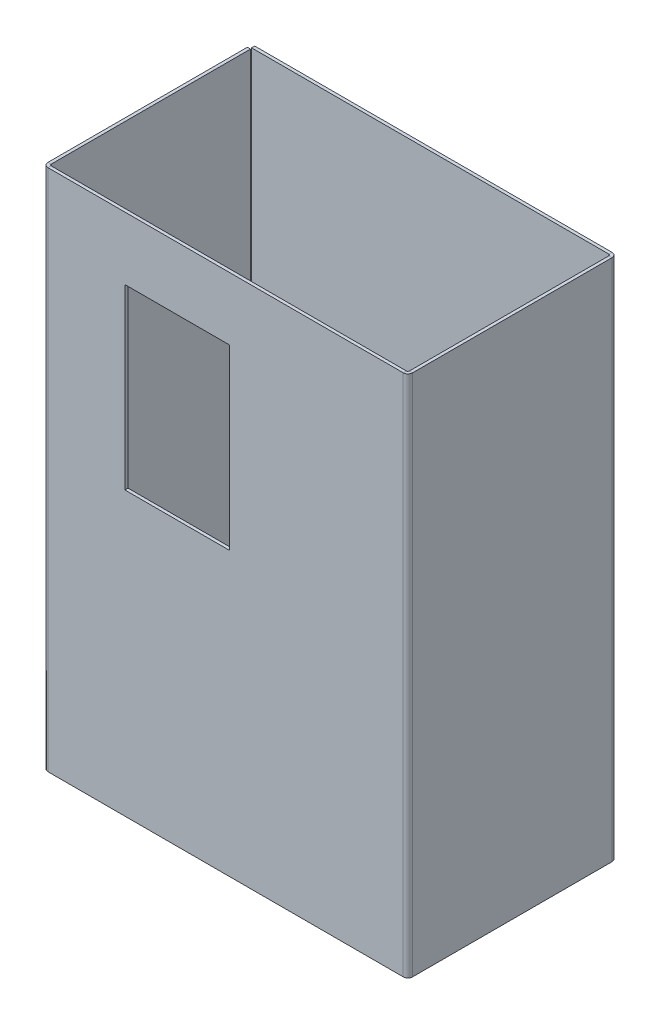
ISO-10303-21;
HEADER;
FILE_DESCRIPTION(('STEP AP214'),'2;1');
FILE_NAME('part.step','',(''),(''),'','','');
FILE_SCHEMA(('AUTOMOTIVE_DESIGN { 1 0 10303 214 1 1 1 1 }'));
ENDSEC;
DATA;
#1=APPLICATION_CONTEXT('core data for automotive mechanical design processes');
#2=APPLICATION_PROTOCOL_DEFINITION('international standard','automotive_design',2000,#1);
#3=PRODUCT_CONTEXT('',#1,'mechanical');
#4=PRODUCT('Part','Part','',(#3));
#5=PRODUCT_RELATED_PRODUCT_CATEGORY('part','',(#4));
#6=PRODUCT_DEFINITION_FORMATION('','',#4);
#7=PRODUCT_DEFINITION_CONTEXT('part definition',#1,'design');
#8=PRODUCT_DEFINITION('design','',#6,#7);
#9=PRODUCT_DEFINITION_SHAPE('','',#8);
#10=(LENGTH_UNIT() NAMED_UNIT(*) SI_UNIT(.MILLI.,.METRE.));
#11=(NAMED_UNIT(*) PLANE_ANGLE_UNIT() SI_UNIT($,.RADIAN.));
#12=(NAMED_UNIT(*) SI_UNIT($,.STERADIAN.) SOLID_ANGLE_UNIT());
#13=UNCERTAINTY_MEASURE_WITH_UNIT(LENGTH_MEASURE(1.E-05),#10,'distance_accuracy_value','');
#14=(GEOMETRIC_REPRESENTATION_CONTEXT(3) GLOBAL_UNCERTAINTY_ASSIGNED_CONTEXT((#13)) GLOBAL_UNIT_ASSIGNED_CONTEXT((#10,
#11,#12)) REPRESENTATION_CONTEXT('',''));
#15=CARTESIAN_POINT('',(0.,0.,0.));
#16=DIRECTION('',(0.,0.,1.));
#17=DIRECTION('',(1.,0.,0.));
#18=AXIS2_PLACEMENT_3D('',#15,#16,#17);
#19=CARTESIAN_POINT('',(199.282314285715,-112.5,267.428545819413));
#20=DIRECTION('',(0.,-1.,0.));
#21=DIRECTION('',(-1.,0.,0.));
#22=AXIS2_PLACEMENT_3D('',#19,#20,#21);
#23=PLANE('',#22);
#24=DIRECTION('',(0.,0.,-1.));
#25=VECTOR('',#24,1.);
#26=CARTESIAN_POINT('',(199.282314285715,-112.5,267.428545819413));
#27=LINE('',#26,#25);
#28=CARTESIAN_POINT('',(199.282314285714,-112.5,-2.2366));
#29=VERTEX_POINT('',#28);
#30=CARTESIAN_POINT('',(199.282314285714,-112.5,-97.4965999999999));
#31=VERTEX_POINT('',#30);
#32=EDGE_CURVE('E296',#29,#31,#27,.T.);
#33=ORIENTED_EDGE('',*,*,#32,.T.);
#34=DIRECTION('',(1.,0.,0.));
#35=VECTOR('',#34,1.);
#36=CARTESIAN_POINT('',(199.282314285714,-112.5,-97.4966));
#37=LINE('',#36,#35);
#38=CARTESIAN_POINT('',(200.782314285714,-112.5,-97.4965999999999));
#39=VERTEX_POINT('',#38);
#40=EDGE_CURVE('E12',#31,#39,#37,.T.);
#41=ORIENTED_EDGE('',*,*,#40,.T.);
#42=DIRECTION('',(0.,0.,-1.));
#43=VECTOR('',#42,1.);
#44=CARTESIAN_POINT('',(200.782314285715,-112.5,267.428545819413));
#45=LINE('',#44,#43);
#46=CARTESIAN_POINT('',(200.782314285714,-112.5,-2.23660000000001));
#47=VERTEX_POINT('',#46);
#48=EDGE_CURVE('E273',#47,#39,#45,.T.);
#49=ORIENTED_EDGE('',*,*,#48,.F.);
#50=DIRECTION('',(1.,0.,0.));
#51=VECTOR('',#50,1.);
#52=CARTESIAN_POINT('',(199.282314285714,-112.5,-2.23660000000012));
#53=LINE('',#52,#51);
#54=EDGE_CURVE('E278',#29,#47,#53,.T.);
#55=ORIENTED_EDGE('',*,*,#54,.F.);
#56=EDGE_LOOP('',(#33,#41,#49,#55));
#57=FACE_BOUND('',#56,.T.);
#58=ADVANCED_FACE('F51',(#57),#23,.T.);
#59=CARTESIAN_POINT('',(199.282314285715,137.5,267.428545819413));
#60=DIRECTION('',(0.,1.,0.));
#61=DIRECTION('',(1.,0.,0.));
#62=AXIS2_PLACEMENT_3D('',#59,#60,#61);
#63=PLANE('',#62);
#64=DIRECTION('',(0.,0.,1.));
#65=VECTOR('',#64,1.);
#66=CARTESIAN_POINT('',(200.782314285715,137.5,267.428545819413));
#67=LINE('',#66,#65);
#68=CARTESIAN_POINT('',(200.782314285714,137.5,-97.4965999999998));
#69=VERTEX_POINT('',#68);
#70=CARTESIAN_POINT('',(200.782314285714,137.5,-2.23660000000001));
#71=VERTEX_POINT('',#70);
#72=EDGE_CURVE('E274',#69,#71,#67,.T.);
#73=ORIENTED_EDGE('',*,*,#72,.F.);
#74=DIRECTION('',(-1.,0.,0.));
#75=VECTOR('',#74,1.);
#76=CARTESIAN_POINT('',(199.282314285714,137.5,-97.4966));
#77=LINE('',#76,#75);
#78=CARTESIAN_POINT('',(199.282314285714,137.5,-97.4965999999999));
#79=VERTEX_POINT('',#78);
#80=EDGE_CURVE('E375',#69,#79,#77,.T.);
#81=ORIENTED_EDGE('',*,*,#80,.T.);
#82=DIRECTION('',(0.,0.,1.));
#83=VECTOR('',#82,1.);
#84=CARTESIAN_POINT('',(199.282314285715,137.5,267.428545819413));
#85=LINE('',#84,#83);
#86=CARTESIAN_POINT('',(199.282314285714,137.5,-2.23660000000001));
#87=VERTEX_POINT('',#86);
#88=EDGE_CURVE('E54',#79,#87,#85,.T.);
#89=ORIENTED_EDGE('',*,*,#88,.T.);
#90=DIRECTION('',(-1.,0.,0.));
#91=VECTOR('',#90,1.);
#92=CARTESIAN_POINT('',(199.282314285714,137.5,-2.23660000000012));
#93=LINE('',#92,#91);
#94=EDGE_CURVE('E275',#71,#87,#93,.T.);
#95=ORIENTED_EDGE('',*,*,#94,.F.);
#96=EDGE_LOOP('',(#73,#81,#89,#95));
#97=FACE_BOUND('',#96,.T.);
#98=ADVANCED_FACE('F389',(#97),#63,.T.);
#99=CARTESIAN_POINT('',(199.282314285715,0.,198.644260105127));
#100=DIRECTION('',(-1.,0.,0.));
#101=DIRECTION('',(0.,0.,1.));
#102=AXIS2_PLACEMENT_3D('',#99,#100,#101);
#103=PLANE('',#102);
#104=ORIENTED_EDGE('',*,*,#88,.F.);
#105=DIRECTION('',(0.,-1.,0.));
#106=VECTOR('',#105,1.);
#107=CARTESIAN_POINT('',(199.282314285714,0.,-97.4966));
#108=LINE('',#107,#106);
#109=EDGE_CURVE('E366',#79,#31,#108,.T.);
#110=ORIENTED_EDGE('',*,*,#109,.T.);
#111=ORIENTED_EDGE('',*,*,#32,.F.);
#112=DIRECTION('',(0.,-1.,0.));
#113=VECTOR('',#112,1.);
#114=CARTESIAN_POINT('',(199.282314285714,0.,-2.23660000000012));
#115=LINE('',#114,#113);
#116=EDGE_CURVE('E265',#87,#29,#115,.T.);
#117=ORIENTED_EDGE('',*,*,#116,.F.);
#118=EDGE_LOOP('',(#104,#110,#111,#117));
#119=FACE_BOUND('',#118,.T.);
#120=ADVANCED_FACE('F393',(#119),#103,.T.);
#121=CARTESIAN_POINT('',(-68.7842857142857,-112.5,-1.5));
#122=DIRECTION('',(0.,-1.,0.));
#123=DIRECTION('',(0.,0.,-1.));
#124=AXIS2_PLACEMENT_3D('',#121,#122,#123);
#125=PLANE('',#124);
#126=DIRECTION('',(1.,0.,0.));
#127=VECTOR('',#126,1.);
#128=CARTESIAN_POINT('',(-68.7842857142857,-112.5,-1.5));
#129=LINE('',#128,#127);
#130=CARTESIAN_POINT('',(28.8157142857143,-112.5,-1.5));
#131=VERTEX_POINT('',#130);
#132=CARTESIAN_POINT('',(198.545714285714,-112.5,-1.5));
#133=VERTEX_POINT('',#132);
#134=EDGE_CURVE('E331',#131,#133,#129,.T.);
#135=ORIENTED_EDGE('',*,*,#134,.T.);
#136=DIRECTION('',(0.,0.,1.));
#137=VECTOR('',#136,1.);
#138=CARTESIAN_POINT('',(198.545714285714,-112.5,-1.5));
#139=LINE('',#138,#137);
#140=CARTESIAN_POINT('',(198.545714285714,-112.5,0.));
#141=VERTEX_POINT('',#140);
#142=EDGE_CURVE('E363',#133,#141,#139,.T.);
#143=ORIENTED_EDGE('',*,*,#142,.T.);
#144=DIRECTION('',(1.,0.,0.));
#145=VECTOR('',#144,1.);
#146=CARTESIAN_POINT('',(-68.7842857142857,-112.5,0.));
#147=LINE('',#146,#145);
#148=CARTESIAN_POINT('',(28.8157142857143,-112.5,0.));
#149=VERTEX_POINT('',#148);
#150=EDGE_CURVE('E311',#149,#141,#147,.T.);
#151=ORIENTED_EDGE('',*,*,#150,.F.);
#152=DIRECTION('',(0.,0.,1.));
#153=VECTOR('',#152,1.);
#154=CARTESIAN_POINT('',(28.8157142857143,-112.5,-1.5));
#155=LINE('',#154,#153);
#156=EDGE_CURVE('E317',#131,#149,#155,.T.);
#157=ORIENTED_EDGE('',*,*,#156,.F.);
#158=EDGE_LOOP('',(#135,#143,#151,#157));
#159=FACE_BOUND('',#158,.T.);
#160=ADVANCED_FACE('F462',(#159),#125,.T.);
#161=CARTESIAN_POINT('',(-68.7842857142857,137.5,-1.5));
#162=DIRECTION('',(0.,1.,0.));
#163=DIRECTION('',(0.,0.,1.));
#164=AXIS2_PLACEMENT_3D('',#161,#162,#163);
#165=PLANE('',#164);
#166=DIRECTION('',(-1.,0.,0.));
#167=VECTOR('',#166,1.);
#168=CARTESIAN_POINT('',(-68.7842857142857,137.5,0.));
#169=LINE('',#168,#167);
#170=CARTESIAN_POINT('',(198.545714285714,137.5,0.));
#171=VERTEX_POINT('',#170);
#172=CARTESIAN_POINT('',(28.8157142857143,137.5,0.));
#173=VERTEX_POINT('',#172);
#174=EDGE_CURVE('E312',#171,#173,#169,.T.);
#175=ORIENTED_EDGE('',*,*,#174,.F.);
#176=DIRECTION('',(0.,0.,-1.));
#177=VECTOR('',#176,1.);
#178=CARTESIAN_POINT('',(198.545714285714,137.5,-1.5));
#179=LINE('',#178,#177);
#180=CARTESIAN_POINT('',(198.545714285714,137.5,-1.5));
#181=VERTEX_POINT('',#180);
#182=EDGE_CURVE('E358',#171,#181,#179,.T.);
#183=ORIENTED_EDGE('',*,*,#182,.T.);
#184=DIRECTION('',(-1.,0.,0.));
#185=VECTOR('',#184,1.);
#186=CARTESIAN_POINT('',(-68.7842857142857,137.5,-1.5));
#187=LINE('',#186,#185);
#188=CARTESIAN_POINT('',(28.8157142857143,137.5,-1.5));
#189=VERTEX_POINT('',#188);
#190=EDGE_CURVE('E316',#181,#189,#187,.T.);
#191=ORIENTED_EDGE('',*,*,#190,.T.);
#192=DIRECTION('',(0.,0.,-1.));
#193=VECTOR('',#192,1.);
#194=CARTESIAN_POINT('',(28.8157142857143,137.5,-1.5));
#195=LINE('',#194,#193);
#196=EDGE_CURVE('E313',#173,#189,#195,.T.);
#197=ORIENTED_EDGE('',*,*,#196,.F.);
#198=EDGE_LOOP('',(#175,#183,#191,#197));
#199=FACE_BOUND('',#198,.T.);
#200=ADVANCED_FACE('F406',(#199),#165,.T.);
#201=CARTESIAN_POINT('',(0.,0.,-1.5));
#202=DIRECTION('',(0.,0.,-1.));
#203=DIRECTION('',(-1.,0.,0.));
#204=AXIS2_PLACEMENT_3D('',#201,#202,#203);
#205=PLANE('',#204);
#206=DIRECTION('',(0.,1.,0.));
#207=VECTOR('',#206,1.);
#208=CARTESIAN_POINT('',(115.549114285714,22.5,-1.5));
#209=LINE('',#208,#207);
#210=CARTESIAN_POINT('',(115.549114285714,22.5,-1.5));
#211=VERTEX_POINT('',#210);
#212=CARTESIAN_POINT('',(115.549114285714,107.5,-1.5));
#213=VERTEX_POINT('',#212);
#214=EDGE_CURVE('E191',#211,#213,#209,.T.);
#215=ORIENTED_EDGE('',*,*,#214,.T.);
#216=DIRECTION('',(-1.,0.,0.));
#217=VECTOR('',#216,1.);
#218=CARTESIAN_POINT('',(115.549114285714,107.5,-1.5));
#219=LINE('',#218,#217);
#220=CARTESIAN_POINT('',(65.5491142857143,107.5,-1.5));
#221=VERTEX_POINT('',#220);
#222=EDGE_CURVE('E200',#213,#221,#219,.T.);
#223=ORIENTED_EDGE('',*,*,#222,.T.);
#224=DIRECTION('',(0.,-1.,0.));
#225=VECTOR('',#224,1.);
#226=CARTESIAN_POINT('',(65.5491142857143,22.5,-1.5));
#227=LINE('',#226,#225);
#228=CARTESIAN_POINT('',(65.5491142857143,22.5,-1.5));
#229=VERTEX_POINT('',#228);
#230=EDGE_CURVE('E67',#221,#229,#227,.T.);
#231=ORIENTED_EDGE('',*,*,#230,.T.);
#232=DIRECTION('',(1.,0.,0.));
#233=VECTOR('',#232,1.);
#234=CARTESIAN_POINT('',(115.549114285714,22.5,-1.5));
#235=LINE('',#234,#233);
#236=EDGE_CURVE('E197',#229,#211,#235,.T.);
#237=ORIENTED_EDGE('',*,*,#236,.T.);
#238=EDGE_LOOP('',(#215,#223,#231,#237));
#239=FACE_BOUND('',#238,.T.);
#240=ORIENTED_EDGE('',*,*,#190,.F.);
#241=DIRECTION('',(0.,-1.,0.));
#242=VECTOR('',#241,1.);
#243=CARTESIAN_POINT('',(198.545714285714,0.,-1.5));
#244=LINE('',#243,#242);
#245=EDGE_CURVE('E349',#181,#133,#244,.T.);
#246=ORIENTED_EDGE('',*,*,#245,.T.);
#247=ORIENTED_EDGE('',*,*,#134,.F.);
#248=DIRECTION('',(0.,-1.,0.));
#249=VECTOR('',#248,1.);
#250=CARTESIAN_POINT('',(28.8157142857143,0.,-1.5));
#251=LINE('',#250,#249);
#252=EDGE_CURVE('E303',#189,#131,#251,.T.);
#253=ORIENTED_EDGE('',*,*,#252,.F.);
#254=EDGE_LOOP('',(#240,#246,#247,#253));
#255=FACE_BOUND('',#254,.T.);
#256=ADVANCED_FACE('F204',(#239,#255),#205,.T.);
#257=CARTESIAN_POINT('',(28.0791142857146,137.5,-97.5014541805867));
#258=DIRECTION('',(0.,1.,0.));
#259=DIRECTION('',(-1.,0.,0.));
#260=AXIS2_PLACEMENT_3D('',#257,#258,#259);
#261=PLANE('',#260);
#262=DIRECTION('',(0.,0.,-1.));
#263=VECTOR('',#262,1.);
#264=CARTESIAN_POINT('',(26.5791142857146,137.5,-97.5014541805867));
#265=LINE('',#264,#263);
#266=CARTESIAN_POINT('',(26.5791142857143,137.5,-2.23659999999999));
#267=VERTEX_POINT('',#266);
#268=CARTESIAN_POINT('',(26.5791142857146,137.5,-97.5014541805867));
#269=VERTEX_POINT('',#268);
#270=EDGE_CURVE('E326',#267,#269,#265,.T.);
#271=ORIENTED_EDGE('',*,*,#270,.F.);
#272=DIRECTION('',(1.,0.,0.));
#273=VECTOR('',#272,1.);
#274=CARTESIAN_POINT('',(28.0791142857143,137.5,-2.23659999999997));
#275=LINE('',#274,#273);
#276=CARTESIAN_POINT('',(28.0791142857143,137.5,-2.2366));
#277=VERTEX_POINT('',#276);
#278=EDGE_CURVE('E341',#267,#277,#275,.T.);
#279=ORIENTED_EDGE('',*,*,#278,.T.);
#280=DIRECTION('',(0.,0.,-1.));
#281=VECTOR('',#280,1.);
#282=CARTESIAN_POINT('',(28.0791142857146,137.5,-97.5014541805867));
#283=LINE('',#282,#281);
#284=CARTESIAN_POINT('',(28.0791142857146,137.5,-97.5014541805867));
#285=VERTEX_POINT('',#284);
#286=EDGE_CURVE('E338',#277,#285,#283,.T.);
#287=ORIENTED_EDGE('',*,*,#286,.T.);
#288=DIRECTION('',(-1.,0.,0.));
#289=VECTOR('',#288,1.);
#290=CARTESIAN_POINT('',(28.0791142857146,137.5,-97.5014541805867));
#291=LINE('',#290,#289);
#292=EDGE_CURVE('E332',#285,#269,#291,.T.);
#293=ORIENTED_EDGE('',*,*,#292,.T.);
#294=EDGE_LOOP('',(#271,#279,#287,#293));
#295=FACE_BOUND('',#294,.T.);
#296=ADVANCED_FACE('F508',(#295),#261,.T.);
#297=CARTESIAN_POINT('',(28.0791142857146,-112.5,-97.5014541805867));
#298=DIRECTION('',(0.,-1.,0.));
#299=DIRECTION('',(1.,0.,0.));
#300=AXIS2_PLACEMENT_3D('',#297,#298,#299);
#301=PLANE('',#300);
#302=DIRECTION('',(0.,0.,1.));
#303=VECTOR('',#302,1.);
#304=CARTESIAN_POINT('',(28.0791142857146,-112.5,-97.5014541805867));
#305=LINE('',#304,#303);
#306=CARTESIAN_POINT('',(28.0791142857146,-112.5,-97.5014541805867));
#307=VERTEX_POINT('',#306);
#308=CARTESIAN_POINT('',(28.0791142857143,-112.5,-2.2366));
#309=VERTEX_POINT('',#308);
#310=EDGE_CURVE('E325',#307,#309,#305,.T.);
#311=ORIENTED_EDGE('',*,*,#310,.T.);
#312=DIRECTION('',(-1.,0.,0.));
#313=VECTOR('',#312,1.);
#314=CARTESIAN_POINT('',(28.0791142857143,-112.5,-2.23659999999997));
#315=LINE('',#314,#313);
#316=CARTESIAN_POINT('',(26.5791142857143,-112.5,-2.23659999999999));
#317=VERTEX_POINT('',#316);
#318=EDGE_CURVE('E346',#309,#317,#315,.T.);
#319=ORIENTED_EDGE('',*,*,#318,.T.);
#320=DIRECTION('',(0.,0.,1.));
#321=VECTOR('',#320,1.);
#322=CARTESIAN_POINT('',(26.5791142857146,-112.5,-97.5014541805867));
#323=LINE('',#322,#321);
#324=CARTESIAN_POINT('',(26.5791142857146,-112.5,-97.5014541805867));
#325=VERTEX_POINT('',#324);
#326=EDGE_CURVE('E330',#325,#317,#323,.T.);
#327=ORIENTED_EDGE('',*,*,#326,.F.);
#328=DIRECTION('',(-1.,0.,0.));
#329=VECTOR('',#328,1.);
#330=CARTESIAN_POINT('',(28.0791142857146,-112.5,-97.5014541805867));
#331=LINE('',#330,#329);
#332=EDGE_CURVE('E336',#307,#325,#331,.T.);
#333=ORIENTED_EDGE('',*,*,#332,.F.);
#334=EDGE_LOOP('',(#311,#319,#327,#333));
#335=FACE_BOUND('',#334,.T.);
#336=ADVANCED_FACE('F506',(#335),#301,.T.);
#337=CARTESIAN_POINT('',(28.0791142857144,0.,-28.717168466301));
#338=DIRECTION('',(1.,0.,0.));
#339=DIRECTION('',(0.,0.,-1.));
#340=AXIS2_PLACEMENT_3D('',#337,#338,#339);
#341=PLANE('',#340);
#342=ORIENTED_EDGE('',*,*,#286,.F.);
#343=DIRECTION('',(0.,-1.,0.));
#344=VECTOR('',#343,1.);
#345=CARTESIAN_POINT('',(28.0791142857143,0.,-2.23659999999997));
#346=LINE('',#345,#344);
#347=EDGE_CURVE('E335',#277,#309,#346,.T.);
#348=ORIENTED_EDGE('',*,*,#347,.T.);
#349=ORIENTED_EDGE('',*,*,#310,.F.);
#350=DIRECTION('',(0.,-1.,0.));
#351=VECTOR('',#350,1.);
#352=CARTESIAN_POINT('',(28.0791142857146,-112.5,-97.5014541805867));
#353=LINE('',#352,#351);
#354=EDGE_CURVE('E322',#285,#307,#353,.T.);
#355=ORIENTED_EDGE('',*,*,#354,.F.);
#356=EDGE_LOOP('',(#342,#348,#349,#355));
#357=FACE_BOUND('',#356,.T.);
#358=ADVANCED_FACE('F502',(#357),#341,.T.);
#359=CARTESIAN_POINT('',(28.0791142857146,-112.5,-97.5014541805867));
#360=DIRECTION('',(0.,0.,-1.));
#361=DIRECTION('',(-1.,0.,0.));
#362=AXIS2_PLACEMENT_3D('',#359,#360,#361);
#363=PLANE('',#362);
#364=DIRECTION('',(0.,-1.,0.));
#365=VECTOR('',#364,1.);
#366=CARTESIAN_POINT('',(26.5791142857146,-112.5,-97.5014541805867));
#367=LINE('',#366,#365);
#368=EDGE_CURVE('E327',#269,#325,#367,.T.);
#369=ORIENTED_EDGE('',*,*,#368,.F.);
#370=ORIENTED_EDGE('',*,*,#292,.F.);
#371=ORIENTED_EDGE('',*,*,#354,.T.);
#372=ORIENTED_EDGE('',*,*,#332,.T.);
#373=EDGE_LOOP('',(#369,#370,#371,#372));
#374=FACE_BOUND('',#373,.T.);
#375=ADVANCED_FACE('F498',(#374),#363,.T.);
#376=CARTESIAN_POINT('',(26.5791142857144,0.,-28.717168466301));
#377=DIRECTION('',(1.,0.,0.));
#378=DIRECTION('',(0.,0.,-1.));
#379=AXIS2_PLACEMENT_3D('',#376,#377,#378);
#380=PLANE('',#379);
#381=DIRECTION('',(0.,-1.,0.));
#382=VECTOR('',#381,1.);
#383=CARTESIAN_POINT('',(26.5791142857143,0.,-2.23659999999998));
#384=LINE('',#383,#382);
#385=EDGE_CURVE('E344',#267,#317,#384,.T.);
#386=ORIENTED_EDGE('',*,*,#385,.F.);
#387=ORIENTED_EDGE('',*,*,#270,.T.);
#388=ORIENTED_EDGE('',*,*,#368,.T.);
#389=ORIENTED_EDGE('',*,*,#326,.T.);
#390=EDGE_LOOP('',(#386,#387,#388,#389));
#391=FACE_BOUND('',#390,.T.);
#392=ADVANCED_FACE('F501',(#391),#380,.F.);
#393=CARTESIAN_POINT('',(0.,0.,0.));
#394=DIRECTION('',(0.,0.,-1.));
#395=DIRECTION('',(-1.,0.,0.));
#396=AXIS2_PLACEMENT_3D('',#393,#394,#395);
#397=PLANE('',#396);
#398=DIRECTION('',(-1.,0.,0.));
#399=VECTOR('',#398,1.);
#400=CARTESIAN_POINT('',(115.549114285714,107.5,0.));
#401=LINE('',#400,#399);
#402=CARTESIAN_POINT('',(115.549114285714,107.5,0.));
#403=VERTEX_POINT('',#402);
#404=CARTESIAN_POINT('',(65.5491142857143,107.5,0.));
#405=VERTEX_POINT('',#404);
#406=EDGE_CURVE('E216',#403,#405,#401,.T.);
#407=ORIENTED_EDGE('',*,*,#406,.F.);
#408=DIRECTION('',(0.,1.,0.));
#409=VECTOR('',#408,1.);
#410=CARTESIAN_POINT('',(115.549114285714,22.5,0.));
#411=LINE('',#410,#409);
#412=CARTESIAN_POINT('',(115.549114285714,22.5,0.));
#413=VERTEX_POINT('',#412);
#414=EDGE_CURVE('E75',#413,#403,#411,.T.);
#415=ORIENTED_EDGE('',*,*,#414,.F.);
#416=DIRECTION('',(1.,0.,0.));
#417=VECTOR('',#416,1.);
#418=CARTESIAN_POINT('',(115.549114285714,22.5,0.));
#419=LINE('',#418,#417);
#420=CARTESIAN_POINT('',(65.5491142857143,22.5,0.));
#421=VERTEX_POINT('',#420);
#422=EDGE_CURVE('E207',#421,#413,#419,.T.);
#423=ORIENTED_EDGE('',*,*,#422,.F.);
#424=DIRECTION('',(0.,-1.,0.));
#425=VECTOR('',#424,1.);
#426=CARTESIAN_POINT('',(65.5491142857143,22.5,0.));
#427=LINE('',#426,#425);
#428=EDGE_CURVE('E210',#405,#421,#427,.T.);
#429=ORIENTED_EDGE('',*,*,#428,.F.);
#430=EDGE_LOOP('',(#407,#415,#423,#429));
#431=FACE_BOUND('',#430,.T.);
#432=DIRECTION('',(0.,-1.,0.));
#433=VECTOR('',#432,1.);
#434=CARTESIAN_POINT('',(198.545714285714,0.,0.));
#435=LINE('',#434,#433);
#436=EDGE_CURVE('E361',#171,#141,#435,.T.);
#437=ORIENTED_EDGE('',*,*,#436,.F.);
#438=ORIENTED_EDGE('',*,*,#174,.T.);
#439=DIRECTION('',(0.,-1.,0.));
#440=VECTOR('',#439,1.);
#441=CARTESIAN_POINT('',(28.8157142857143,0.,0.));
#442=LINE('',#441,#440);
#443=EDGE_CURVE('E308',#173,#149,#442,.T.);
#444=ORIENTED_EDGE('',*,*,#443,.T.);
#445=ORIENTED_EDGE('',*,*,#150,.T.);
#446=EDGE_LOOP('',(#437,#438,#444,#445));
#447=FACE_BOUND('',#446,.T.);
#448=ADVANCED_FACE('F493',(#431,#447),#397,.F.);
#449=CARTESIAN_POINT('',(28.8157142857143,137.5,-2.2366));
#450=DIRECTION('',(0.,-1.,0.));
#451=DIRECTION('',(0.,0.,-1.));
#452=AXIS2_PLACEMENT_3D('',#449,#450,#451);
#453=PLANE('',#452);
#454=ORIENTED_EDGE('',*,*,#278,.F.);
#455=CARTESIAN_POINT('',(28.8157142857143,137.5,-2.2366));
#456=DIRECTION('',(0.,1.,0.));
#457=DIRECTION('',(-1.,0.,0.));
#458=AXIS2_PLACEMENT_3D('',#455,#456,#457);
#459=CIRCLE('',#458,2.2366);
#460=EDGE_CURVE('E290',#267,#173,#459,.T.);
#461=ORIENTED_EDGE('',*,*,#460,.T.);
#462=ORIENTED_EDGE('',*,*,#196,.T.);
#463=CARTESIAN_POINT('',(28.8157142857143,137.5,-2.2366));
#464=DIRECTION('',(0.,1.,0.));
#465=DIRECTION('',(0.,0.,-1.));
#466=AXIS2_PLACEMENT_3D('',#463,#464,#465);
#467=CIRCLE('',#466,0.7366);
#468=EDGE_CURVE('E297',#277,#189,#467,.T.);
#469=ORIENTED_EDGE('',*,*,#468,.F.);
#470=EDGE_LOOP('',(#454,#461,#462,#469));
#471=FACE_BOUND('',#470,.T.);
#472=ADVANCED_FACE('F490',(#471),#453,.F.);
#473=CARTESIAN_POINT('',(28.8157142857143,-112.5,-2.2366));
#474=DIRECTION('',(0.,1.,0.));
#475=DIRECTION('',(0.,0.,1.));
#476=AXIS2_PLACEMENT_3D('',#473,#474,#475);
#477=PLANE('',#476);
#478=CARTESIAN_POINT('',(28.8157142857143,-112.5,-2.2366));
#479=DIRECTION('',(0.,1.,0.));
#480=DIRECTION('',(-1.,0.,0.));
#481=AXIS2_PLACEMENT_3D('',#478,#479,#480);
#482=CIRCLE('',#481,2.2366);
#483=EDGE_CURVE('E301',#149,#317,#482,.F.);
#484=ORIENTED_EDGE('',*,*,#483,.T.);
#485=ORIENTED_EDGE('',*,*,#318,.F.);
#486=CARTESIAN_POINT('',(28.8157142857143,-112.5,-2.2366));
#487=DIRECTION('',(0.,-1.,0.));
#488=DIRECTION('',(0.,0.,1.));
#489=AXIS2_PLACEMENT_3D('',#486,#487,#488);
#490=CIRCLE('',#489,0.7366);
#491=EDGE_CURVE('E300',#131,#309,#490,.T.);
#492=ORIENTED_EDGE('',*,*,#491,.F.);
#493=ORIENTED_EDGE('',*,*,#156,.T.);
#494=EDGE_LOOP('',(#484,#485,#492,#493));
#495=FACE_BOUND('',#494,.T.);
#496=ADVANCED_FACE('F485',(#495),#477,.F.);
#497=CARTESIAN_POINT('',(28.8157142857143,-237.515405337347,-2.2366));
#498=DIRECTION('',(0.,1.,0.));
#499=DIRECTION('',(-1.,0.,0.));
#500=AXIS2_PLACEMENT_3D('',#497,#498,#499);
#501=CYLINDRICAL_SURFACE('',#500,0.7366);
#502=ORIENTED_EDGE('',*,*,#252,.T.);
#503=ORIENTED_EDGE('',*,*,#491,.T.);
#504=ORIENTED_EDGE('',*,*,#347,.F.);
#505=ORIENTED_EDGE('',*,*,#468,.T.);
#506=EDGE_LOOP('',(#502,#503,#504,#505));
#507=FACE_BOUND('',#506,.T.);
#508=ADVANCED_FACE('F482',(#507),#501,.F.);
#509=CARTESIAN_POINT('',(28.8157142857143,-237.515405337347,-2.2366));
#510=DIRECTION('',(0.,1.,0.));
#511=DIRECTION('',(-1.,0.,0.));
#512=AXIS2_PLACEMENT_3D('',#509,#510,#511);
#513=CYLINDRICAL_SURFACE('',#512,2.2366);
#514=ORIENTED_EDGE('',*,*,#443,.F.);
#515=ORIENTED_EDGE('',*,*,#460,.F.);
#516=ORIENTED_EDGE('',*,*,#385,.T.);
#517=ORIENTED_EDGE('',*,*,#483,.F.);
#518=EDGE_LOOP('',(#514,#515,#516,#517));
#519=FACE_BOUND('',#518,.T.);
#520=ADVANCED_FACE('F481',(#519),#513,.T.);
#521=CARTESIAN_POINT('',(198.545714285714,137.5,-2.2366));
#522=DIRECTION('',(0.,-1.,0.));
#523=DIRECTION('',(0.,0.,-1.));
#524=AXIS2_PLACEMENT_3D('',#521,#522,#523);
#525=PLANE('',#524);
#526=ORIENTED_EDGE('',*,*,#182,.F.);
#527=CARTESIAN_POINT('',(198.545714285714,137.5,-2.2366));
#528=DIRECTION('',(0.,-1.,0.));
#529=DIRECTION('',(0.,0.,-1.));
#530=AXIS2_PLACEMENT_3D('',#527,#528,#529);
#531=CIRCLE('',#530,2.2366);
#532=EDGE_CURVE('E293',#171,#71,#531,.F.);
#533=ORIENTED_EDGE('',*,*,#532,.T.);
#534=ORIENTED_EDGE('',*,*,#94,.T.);
#535=CARTESIAN_POINT('',(198.545714285714,137.5,-2.2366));
#536=DIRECTION('',(0.,1.,0.));
#537=DIRECTION('',(0.,0.,-1.));
#538=AXIS2_PLACEMENT_3D('',#535,#536,#537);
#539=CIRCLE('',#538,0.736600000000002);
#540=EDGE_CURVE('E283',#181,#87,#539,.T.);
#541=ORIENTED_EDGE('',*,*,#540,.F.);
#542=EDGE_LOOP('',(#526,#533,#534,#541));
#543=FACE_BOUND('',#542,.T.);
#544=ADVANCED_FACE('F397',(#543),#525,.F.);
#545=CARTESIAN_POINT('',(198.545714285714,-112.5,-2.2366));
#546=DIRECTION('',(0.,1.,0.));
#547=DIRECTION('',(0.,0.,1.));
#548=AXIS2_PLACEMENT_3D('',#545,#546,#547);
#549=PLANE('',#548);
#550=ORIENTED_EDGE('',*,*,#54,.T.);
#551=CARTESIAN_POINT('',(198.545714285714,-112.5,-2.2366));
#552=DIRECTION('',(0.,-1.,0.));
#553=DIRECTION('',(0.,0.,-1.));
#554=AXIS2_PLACEMENT_3D('',#551,#552,#553);
#555=CIRCLE('',#554,2.2366);
#556=EDGE_CURVE('E287',#47,#141,#555,.T.);
#557=ORIENTED_EDGE('',*,*,#556,.T.);
#558=ORIENTED_EDGE('',*,*,#142,.F.);
#559=CARTESIAN_POINT('',(198.545714285714,-112.5,-2.2366));
#560=DIRECTION('',(0.,-1.,0.));
#561=DIRECTION('',(0.,0.,1.));
#562=AXIS2_PLACEMENT_3D('',#559,#560,#561);
#563=CIRCLE('',#562,0.736600000000002);
#564=EDGE_CURVE('E286',#29,#133,#563,.T.);
#565=ORIENTED_EDGE('',*,*,#564,.F.);
#566=EDGE_LOOP('',(#550,#557,#558,#565));
#567=FACE_BOUND('',#566,.T.);
#568=ADVANCED_FACE('F413',(#567),#549,.F.);
#569=CARTESIAN_POINT('',(198.545714285714,262.515405337347,-2.2366));
#570=DIRECTION('',(0.,-1.,0.));
#571=DIRECTION('',(0.,0.,-1.));
#572=AXIS2_PLACEMENT_3D('',#569,#570,#571);
#573=CYLINDRICAL_SURFACE('',#572,0.7366);
#574=ORIENTED_EDGE('',*,*,#564,.T.);
#575=ORIENTED_EDGE('',*,*,#245,.F.);
#576=ORIENTED_EDGE('',*,*,#540,.T.);
#577=ORIENTED_EDGE('',*,*,#116,.T.);
#578=EDGE_LOOP('',(#574,#575,#576,#577));
#579=FACE_BOUND('',#578,.T.);
#580=ADVANCED_FACE('F400',(#579),#573,.F.);
#581=CARTESIAN_POINT('',(198.545714285714,262.515405337347,-2.2366));
#582=DIRECTION('',(0.,-1.,0.));
#583=DIRECTION('',(0.,0.,-1.));
#584=AXIS2_PLACEMENT_3D('',#581,#582,#583);
#585=CYLINDRICAL_SURFACE('',#584,2.2366);
#586=ORIENTED_EDGE('',*,*,#556,.F.);
#587=DIRECTION('',(0.,-1.,0.));
#588=VECTOR('',#587,1.);
#589=CARTESIAN_POINT('',(200.782314285714,0.,-2.23660000000012));
#590=LINE('',#589,#588);
#591=EDGE_CURVE('E270',#71,#47,#590,.T.);
#592=ORIENTED_EDGE('',*,*,#591,.F.);
#593=ORIENTED_EDGE('',*,*,#532,.F.);
#594=ORIENTED_EDGE('',*,*,#436,.T.);
#595=EDGE_LOOP('',(#586,#592,#593,#594));
#596=FACE_BOUND('',#595,.T.);
#597=ADVANCED_FACE('F410',(#596),#585,.T.);
#598=CARTESIAN_POINT('',(200.782314285715,0.,198.644260105127));
#599=DIRECTION('',(-1.,0.,0.));
#600=DIRECTION('',(0.,0.,1.));
#601=AXIS2_PLACEMENT_3D('',#598,#599,#600);
#602=PLANE('',#601);
#603=DIRECTION('',(0.,-1.,0.));
#604=VECTOR('',#603,1.);
#605=CARTESIAN_POINT('',(200.782314285714,0.,-97.4966));
#606=LINE('',#605,#604);
#607=EDGE_CURVE('E59',#69,#39,#606,.T.);
#608=ORIENTED_EDGE('',*,*,#607,.F.);
#609=ORIENTED_EDGE('',*,*,#72,.T.);
#610=ORIENTED_EDGE('',*,*,#591,.T.);
#611=ORIENTED_EDGE('',*,*,#48,.T.);
#612=EDGE_LOOP('',(#608,#609,#610,#611));
#613=FACE_BOUND('',#612,.T.);
#614=ADVANCED_FACE('F411',(#613),#602,.F.);
#615=CARTESIAN_POINT('',(198.545714285714,137.5,-97.4966));
#616=DIRECTION('',(0.,-1.,0.));
#617=DIRECTION('',(0.,0.,-1.));
#618=AXIS2_PLACEMENT_3D('',#615,#616,#617);
#619=PLANE('',#618);
#620=ORIENTED_EDGE('',*,*,#80,.F.);
#621=CARTESIAN_POINT('',(198.545714285714,137.5,-97.4966));
#622=DIRECTION('',(0.,-1.,0.));
#623=DIRECTION('',(0.,0.,-1.));
#624=AXIS2_PLACEMENT_3D('',#621,#622,#623);
#625=CIRCLE('',#624,2.2366);
#626=CARTESIAN_POINT('',(198.545714285714,137.5,-99.7331999999999));
#627=VERTEX_POINT('',#626);
#628=EDGE_CURVE('E229',#69,#627,#625,.F.);
#629=ORIENTED_EDGE('',*,*,#628,.T.);
#630=DIRECTION('',(0.,0.,1.));
#631=VECTOR('',#630,1.);
#632=CARTESIAN_POINT('',(198.545714285714,137.5,-98.2331999999999));
#633=LINE('',#632,#631);
#634=CARTESIAN_POINT('',(198.545714285714,137.5,-98.2331999999999));
#635=VERTEX_POINT('',#634);
#636=EDGE_CURVE('E250',#627,#635,#633,.T.);
#637=ORIENTED_EDGE('',*,*,#636,.T.);
#638=CARTESIAN_POINT('',(198.545714285714,137.5,-97.4966));
#639=DIRECTION('',(0.,1.,0.));
#640=DIRECTION('',(0.,0.,-1.));
#641=AXIS2_PLACEMENT_3D('',#638,#639,#640);
#642=CIRCLE('',#641,0.736600000000004);
#643=EDGE_CURVE('E258',#79,#635,#642,.T.);
#644=ORIENTED_EDGE('',*,*,#643,.F.);
#645=EDGE_LOOP('',(#620,#629,#637,#644));
#646=FACE_BOUND('',#645,.T.);
#647=ADVANCED_FACE('F433',(#646),#619,.F.);
#648=CARTESIAN_POINT('',(198.545714285714,-112.5,-97.4966));
#649=DIRECTION('',(0.,1.,0.));
#650=DIRECTION('',(0.,0.,1.));
#651=AXIS2_PLACEMENT_3D('',#648,#649,#650);
#652=PLANE('',#651);
#653=DIRECTION('',(0.,0.,-1.));
#654=VECTOR('',#653,1.);
#655=CARTESIAN_POINT('',(198.545714285714,-112.5,-98.2331999999999));
#656=LINE('',#655,#654);
#657=CARTESIAN_POINT('',(198.545714285714,-112.5,-98.2332));
#658=VERTEX_POINT('',#657);
#659=CARTESIAN_POINT('',(198.545714285714,-112.5,-99.7331999999999));
#660=VERTEX_POINT('',#659);
#661=EDGE_CURVE('E253',#658,#660,#656,.T.);
#662=ORIENTED_EDGE('',*,*,#661,.T.);
#663=CARTESIAN_POINT('',(198.545714285714,-112.5,-97.4966));
#664=DIRECTION('',(0.,-1.,0.));
#665=DIRECTION('',(0.,0.,-1.));
#666=AXIS2_PLACEMENT_3D('',#663,#664,#665);
#667=CIRCLE('',#666,2.2366);
#668=EDGE_CURVE('E262',#660,#39,#667,.T.);
#669=ORIENTED_EDGE('',*,*,#668,.T.);
#670=ORIENTED_EDGE('',*,*,#40,.F.);
#671=CARTESIAN_POINT('',(198.545714285714,-112.5,-97.4966));
#672=DIRECTION('',(0.,-1.,0.));
#673=DIRECTION('',(0.,0.,1.));
#674=AXIS2_PLACEMENT_3D('',#671,#672,#673);
#675=CIRCLE('',#674,0.736600000000004);
#676=EDGE_CURVE('E261',#658,#31,#675,.T.);
#677=ORIENTED_EDGE('',*,*,#676,.F.);
#678=EDGE_LOOP('',(#662,#669,#670,#677));
#679=FACE_BOUND('',#678,.T.);
#680=ADVANCED_FACE('F417',(#679),#652,.F.);
#681=CARTESIAN_POINT('',(198.545714285714,262.515405337347,-97.4966));
#682=DIRECTION('',(0.,-1.,0.));
#683=DIRECTION('',(0.,0.,-1.));
#684=AXIS2_PLACEMENT_3D('',#681,#682,#683);
#685=CYLINDRICAL_SURFACE('',#684,0.7366);
#686=ORIENTED_EDGE('',*,*,#676,.T.);
#687=ORIENTED_EDGE('',*,*,#109,.F.);
#688=ORIENTED_EDGE('',*,*,#643,.T.);
#689=DIRECTION('',(0.,-1.,0.));
#690=VECTOR('',#689,1.);
#691=CARTESIAN_POINT('',(198.545714285714,0.,-98.2331999999999));
#692=LINE('',#691,#690);
#693=EDGE_CURVE('E222',#635,#658,#692,.T.);
#694=ORIENTED_EDGE('',*,*,#693,.T.);
#695=EDGE_LOOP('',(#686,#687,#688,#694));
#696=FACE_BOUND('',#695,.T.);
#697=ADVANCED_FACE('F421',(#696),#685,.F.);
#698=CARTESIAN_POINT('',(198.545714285714,262.515405337347,-97.4966));
#699=DIRECTION('',(0.,-1.,0.));
#700=DIRECTION('',(0.,0.,-1.));
#701=AXIS2_PLACEMENT_3D('',#698,#699,#700);
#702=CYLINDRICAL_SURFACE('',#701,2.2366);
#703=ORIENTED_EDGE('',*,*,#668,.F.);
#704=DIRECTION('',(0.,-1.,0.));
#705=VECTOR('',#704,1.);
#706=CARTESIAN_POINT('',(198.545714285714,0.,-99.7331999999999));
#707=LINE('',#706,#705);
#708=EDGE_CURVE('E237',#627,#660,#707,.T.);
#709=ORIENTED_EDGE('',*,*,#708,.F.);
#710=ORIENTED_EDGE('',*,*,#628,.F.);
#711=ORIENTED_EDGE('',*,*,#607,.T.);
#712=EDGE_LOOP('',(#703,#709,#710,#711));
#713=FACE_BOUND('',#712,.T.);
#714=ADVANCED_FACE('F436',(#713),#702,.T.);
#715=CARTESIAN_POINT('',(27.8260059245402,-112.5,-98.2331999999987));
#716=DIRECTION('',(-1.,0.,0.));
#717=DIRECTION('',(0.,0.,1.));
#718=AXIS2_PLACEMENT_3D('',#715,#716,#717);
#719=PLANE('',#718);
#720=DIRECTION('',(0.,1.,0.));
#721=VECTOR('',#720,1.);
#722=CARTESIAN_POINT('',(27.8260059245402,-112.5,-99.7331999999987));
#723=LINE('',#722,#721);
#724=CARTESIAN_POINT('',(27.8260059245402,-112.5,-99.7331999999987));
#725=VERTEX_POINT('',#724);
#726=CARTESIAN_POINT('',(27.8260059245402,137.5,-99.7331999999987));
#727=VERTEX_POINT('',#726);
#728=EDGE_CURVE('E232',#725,#727,#723,.T.);
#729=ORIENTED_EDGE('',*,*,#728,.F.);
#730=DIRECTION('',(0.,0.,-1.));
#731=VECTOR('',#730,1.);
#732=CARTESIAN_POINT('',(27.8260059245402,-112.5,-98.2331999999987));
#733=LINE('',#732,#731);
#734=CARTESIAN_POINT('',(27.8260059245402,-112.5,-98.2331999999987));
#735=VERTEX_POINT('',#734);
#736=EDGE_CURVE('E226',#735,#725,#733,.T.);
#737=ORIENTED_EDGE('',*,*,#736,.F.);
#738=DIRECTION('',(0.,1.,0.));
#739=VECTOR('',#738,1.);
#740=CARTESIAN_POINT('',(27.8260059245402,-112.5,-98.2331999999987));
#741=LINE('',#740,#739);
#742=CARTESIAN_POINT('',(27.8260059245402,137.5,-98.2331999999987));
#743=VERTEX_POINT('',#742);
#744=EDGE_CURVE('E247',#735,#743,#741,.T.);
#745=ORIENTED_EDGE('',*,*,#744,.T.);
#746=DIRECTION('',(0.,0.,-1.));
#747=VECTOR('',#746,1.);
#748=CARTESIAN_POINT('',(27.8260059245402,137.5,-98.2331999999987));
#749=LINE('',#748,#747);
#750=EDGE_CURVE('E245',#743,#727,#749,.T.);
#751=ORIENTED_EDGE('',*,*,#750,.T.);
#752=EDGE_LOOP('',(#729,#737,#745,#751));
#753=FACE_BOUND('',#752,.T.);
#754=ADVANCED_FACE('F444',(#753),#719,.T.);
#755=CARTESIAN_POINT('',(497.021720210255,0.,-98.233200000002));
#756=DIRECTION('',(0.,0.,1.));
#757=DIRECTION('',(1.,0.,0.));
#758=AXIS2_PLACEMENT_3D('',#755,#756,#757);
#759=PLANE('',#758);
#760=ORIENTED_EDGE('',*,*,#693,.F.);
#761=DIRECTION('',(1.,0.,0.));
#762=VECTOR('',#761,1.);
#763=CARTESIAN_POINT('',(565.80600592454,137.5,-98.2332000000025));
#764=LINE('',#763,#762);
#765=EDGE_CURVE('E242',#743,#635,#764,.T.);
#766=ORIENTED_EDGE('',*,*,#765,.F.);
#767=ORIENTED_EDGE('',*,*,#744,.F.);
#768=DIRECTION('',(-1.,0.,0.));
#769=VECTOR('',#768,1.);
#770=CARTESIAN_POINT('',(565.80600592454,-112.5,-98.2332000000025));
#771=LINE('',#770,#769);
#772=EDGE_CURVE('E230',#658,#735,#771,.T.);
#773=ORIENTED_EDGE('',*,*,#772,.F.);
#774=EDGE_LOOP('',(#760,#766,#767,#773));
#775=FACE_BOUND('',#774,.T.);
#776=ADVANCED_FACE('F425',(#775),#759,.T.);
#777=CARTESIAN_POINT('',(565.80600592454,137.5,-98.2332000000025));
#778=DIRECTION('',(0.,1.,0.));
#779=DIRECTION('',(0.,0.,-1.));
#780=AXIS2_PLACEMENT_3D('',#777,#778,#779);
#781=PLANE('',#780);
#782=ORIENTED_EDGE('',*,*,#636,.F.);
#783=DIRECTION('',(1.,0.,0.));
#784=VECTOR('',#783,1.);
#785=CARTESIAN_POINT('',(565.80600592454,137.5,-99.7332000000025));
#786=LINE('',#785,#784);
#787=EDGE_CURVE('E240',#727,#627,#786,.T.);
#788=ORIENTED_EDGE('',*,*,#787,.F.);
#789=ORIENTED_EDGE('',*,*,#750,.F.);
#790=ORIENTED_EDGE('',*,*,#765,.T.);
#791=EDGE_LOOP('',(#782,#788,#789,#790));
#792=FACE_BOUND('',#791,.T.);
#793=ADVANCED_FACE('F429',(#792),#781,.T.);
#794=CARTESIAN_POINT('',(497.021720210255,0.,-99.733200000002));
#795=DIRECTION('',(0.,0.,1.));
#796=DIRECTION('',(1.,0.,0.));
#797=AXIS2_PLACEMENT_3D('',#794,#795,#796);
#798=PLANE('',#797);
#799=ORIENTED_EDGE('',*,*,#787,.T.);
#800=ORIENTED_EDGE('',*,*,#708,.T.);
#801=DIRECTION('',(-1.,0.,0.));
#802=VECTOR('',#801,1.);
#803=CARTESIAN_POINT('',(565.80600592454,-112.5,-99.7332000000025));
#804=LINE('',#803,#802);
#805=EDGE_CURVE('E235',#660,#725,#804,.T.);
#806=ORIENTED_EDGE('',*,*,#805,.T.);
#807=ORIENTED_EDGE('',*,*,#728,.T.);
#808=EDGE_LOOP('',(#799,#800,#806,#807));
#809=FACE_BOUND('',#808,.T.);
#810=ADVANCED_FACE('F438',(#809),#798,.F.);
#811=CARTESIAN_POINT('',(565.80600592454,-112.5,-98.2332000000025));
#812=DIRECTION('',(0.,-1.,0.));
#813=DIRECTION('',(0.,0.,1.));
#814=AXIS2_PLACEMENT_3D('',#811,#812,#813);
#815=PLANE('',#814);
#816=ORIENTED_EDGE('',*,*,#661,.F.);
#817=ORIENTED_EDGE('',*,*,#772,.T.);
#818=ORIENTED_EDGE('',*,*,#736,.T.);
#819=ORIENTED_EDGE('',*,*,#805,.F.);
#820=EDGE_LOOP('',(#816,#817,#818,#819));
#821=FACE_BOUND('',#820,.T.);
#822=ADVANCED_FACE('F440',(#821),#815,.T.);
#823=CARTESIAN_POINT('',(115.549114285714,22.5,-1.5));
#824=DIRECTION('',(1.,0.,0.));
#825=DIRECTION('',(0.,0.,-1.));
#826=AXIS2_PLACEMENT_3D('',#823,#824,#825);
#827=PLANE('',#826);
#828=ORIENTED_EDGE('',*,*,#414,.T.);
#829=DIRECTION('',(0.,0.,1.));
#830=VECTOR('',#829,1.);
#831=CARTESIAN_POINT('',(115.549114285714,107.5,-1.5));
#832=LINE('',#831,#830);
#833=EDGE_CURVE('E187',#213,#403,#832,.T.);
#834=ORIENTED_EDGE('',*,*,#833,.F.);
#835=ORIENTED_EDGE('',*,*,#214,.F.);
#836=DIRECTION('',(0.,0.,1.));
#837=VECTOR('',#836,1.);
#838=CARTESIAN_POINT('',(115.549114285714,22.5,-1.5));
#839=LINE('',#838,#837);
#840=EDGE_CURVE('E220',#211,#413,#839,.T.);
#841=ORIENTED_EDGE('',*,*,#840,.T.);
#842=EDGE_LOOP('',(#828,#834,#835,#841));
#843=FACE_BOUND('',#842,.T.);
#844=ADVANCED_FACE('F189',(#843),#827,.F.);
#845=CARTESIAN_POINT('',(115.549114285714,22.5,-1.5));
#846=DIRECTION('',(0.,-1.,0.));
#847=DIRECTION('',(1.,0.,0.));
#848=AXIS2_PLACEMENT_3D('',#845,#846,#847);
#849=PLANE('',#848);
#850=ORIENTED_EDGE('',*,*,#422,.T.);
#851=ORIENTED_EDGE('',*,*,#840,.F.);
#852=ORIENTED_EDGE('',*,*,#236,.F.);
#853=DIRECTION('',(0.,0.,1.));
#854=VECTOR('',#853,1.);
#855=CARTESIAN_POINT('',(65.5491142857143,22.5,-1.5));
#856=LINE('',#855,#854);
#857=EDGE_CURVE('E223',#229,#421,#856,.T.);
#858=ORIENTED_EDGE('',*,*,#857,.T.);
#859=EDGE_LOOP('',(#850,#851,#852,#858));
#860=FACE_BOUND('',#859,.T.);
#861=ADVANCED_FACE('F709',(#860),#849,.F.);
#862=CARTESIAN_POINT('',(65.5491142857143,22.5,-1.5));
#863=DIRECTION('',(-1.,0.,0.));
#864=DIRECTION('',(0.,0.,1.));
#865=AXIS2_PLACEMENT_3D('',#862,#863,#864);
#866=PLANE('',#865);
#867=ORIENTED_EDGE('',*,*,#428,.T.);
#868=ORIENTED_EDGE('',*,*,#857,.F.);
#869=ORIENTED_EDGE('',*,*,#230,.F.);
#870=DIRECTION('',(0.,0.,1.));
#871=VECTOR('',#870,1.);
#872=CARTESIAN_POINT('',(65.5491142857143,107.5,-1.5));
#873=LINE('',#872,#871);
#874=EDGE_CURVE('E196',#221,#405,#873,.T.);
#875=ORIENTED_EDGE('',*,*,#874,.T.);
#876=EDGE_LOOP('',(#867,#868,#869,#875));
#877=FACE_BOUND('',#876,.T.);
#878=ADVANCED_FACE('F714',(#877),#866,.F.);
#879=CARTESIAN_POINT('',(115.549114285714,107.5,-1.5));
#880=DIRECTION('',(0.,1.,0.));
#881=DIRECTION('',(0.,0.,1.));
#882=AXIS2_PLACEMENT_3D('',#879,#880,#881);
#883=PLANE('',#882);
#884=ORIENTED_EDGE('',*,*,#406,.T.);
#885=ORIENTED_EDGE('',*,*,#874,.F.);
#886=ORIENTED_EDGE('',*,*,#222,.F.);
#887=ORIENTED_EDGE('',*,*,#833,.T.);
#888=EDGE_LOOP('',(#884,#885,#886,#887));
#889=FACE_BOUND('',#888,.T.);
#890=ADVANCED_FACE('F201',(#889),#883,.F.);
#891=CLOSED_SHELL('',(#58,#98,#120,#160,#200,#256,#296,#336,#358,#375,#392,#448,#472,#496,#508,
#520,#544,#568,#580,#597,#614,#647,#680,#697,#714,#754,#776,#793,#810,#822,#844,#861,#878,#890));
#892=MANIFOLD_SOLID_BREP('B2',#891);
#893=ADVANCED_BREP_SHAPE_REPRESENTATION('',(#18,#892),#14);
#894=SHAPE_DEFINITION_REPRESENTATION(#9,#893);
ENDSEC;
END-ISO-10303-21;
